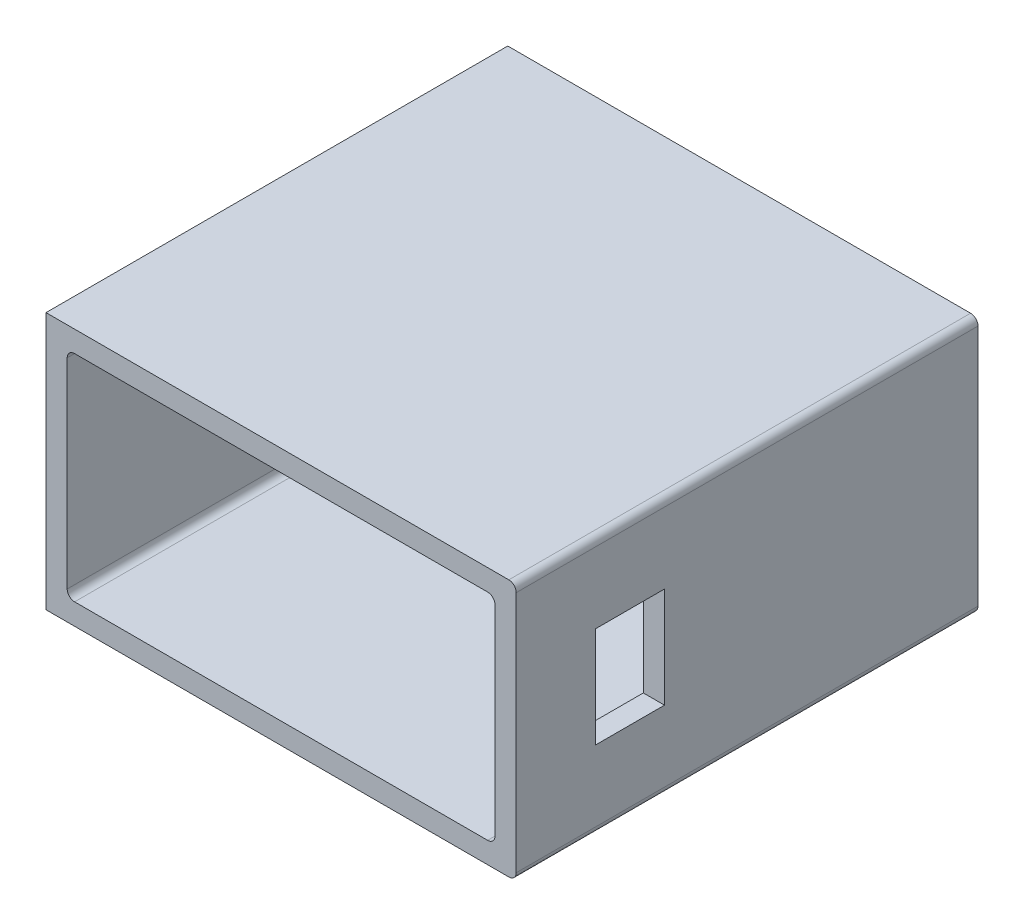
ISO-10303-21;
HEADER;
FILE_DESCRIPTION(('STEP AP214'),'2;1');
FILE_NAME('part.step','',(''),(''),'','','');
FILE_SCHEMA(('AUTOMOTIVE_DESIGN { 1 0 10303 214 1 1 1 1 }'));
ENDSEC;
DATA;
#1=APPLICATION_CONTEXT('core data for automotive mechanical design processes');
#2=APPLICATION_PROTOCOL_DEFINITION('international standard','automotive_design',2000,#1);
#3=PRODUCT_CONTEXT('',#1,'mechanical');
#4=PRODUCT('Part','Part','',(#3));
#5=PRODUCT_RELATED_PRODUCT_CATEGORY('part','',(#4));
#6=PRODUCT_DEFINITION_FORMATION('','',#4);
#7=PRODUCT_DEFINITION_CONTEXT('part definition',#1,'design');
#8=PRODUCT_DEFINITION('design','',#6,#7);
#9=PRODUCT_DEFINITION_SHAPE('','',#8);
#10=(LENGTH_UNIT() NAMED_UNIT(*) SI_UNIT(.MILLI.,.METRE.));
#11=(NAMED_UNIT(*) PLANE_ANGLE_UNIT() SI_UNIT($,.RADIAN.));
#12=(NAMED_UNIT(*) SI_UNIT($,.STERADIAN.) SOLID_ANGLE_UNIT());
#13=UNCERTAINTY_MEASURE_WITH_UNIT(LENGTH_MEASURE(1.E-05),#10,'distance_accuracy_value','');
#14=(GEOMETRIC_REPRESENTATION_CONTEXT(3) GLOBAL_UNCERTAINTY_ASSIGNED_CONTEXT((#13)) GLOBAL_UNIT_ASSIGNED_CONTEXT((#10,
#11,#12)) REPRESENTATION_CONTEXT('',''));
#15=CARTESIAN_POINT('',(0.,0.,0.));
#16=DIRECTION('',(0.,0.,1.));
#17=DIRECTION('',(1.,0.,0.));
#18=AXIS2_PLACEMENT_3D('',#15,#16,#17);
#19=CARTESIAN_POINT('',(0.,12.15,42.));
#20=DIRECTION('',(0.,1.,0.));
#21=DIRECTION('',(0.,0.,1.));
#22=AXIS2_PLACEMENT_3D('',#19,#20,#21);
#23=PLANE('',#22);
#24=DIRECTION('',(1.,0.,0.));
#25=VECTOR('',#24,1.);
#26=CARTESIAN_POINT('',(0.,12.15,42.));
#27=LINE('',#26,#25);
#28=CARTESIAN_POINT('',(58.2500000000001,12.1499999999999,42.));
#29=VERTEX_POINT('',#28);
#30=CARTESIAN_POINT('',(101.95,12.15,42.));
#31=VERTEX_POINT('',#30);
#32=EDGE_CURVE('E274',#29,#31,#27,.T.);
#33=ORIENTED_EDGE('',*,*,#32,.T.);
#34=DIRECTION('',(0.,0.,-1.));
#35=VECTOR('',#34,1.);
#36=CARTESIAN_POINT('',(101.95,12.15,42.));
#37=LINE('',#36,#35);
#38=CARTESIAN_POINT('',(101.95,12.1499999999999,-1.6));
#39=VERTEX_POINT('',#38);
#40=EDGE_CURVE('E206',#31,#39,#37,.T.);
#41=ORIENTED_EDGE('',*,*,#40,.T.);
#42=DIRECTION('',(1.,0.,0.));
#43=VECTOR('',#42,1.);
#44=CARTESIAN_POINT('',(102.65,12.1499999999999,-1.6));
#45=LINE('',#44,#43);
#46=CARTESIAN_POINT('',(58.2500000000001,12.1499999999999,-1.6));
#47=VERTEX_POINT('',#46);
#48=EDGE_CURVE('E203',#47,#39,#45,.T.);
#49=ORIENTED_EDGE('',*,*,#48,.F.);
#50=DIRECTION('',(0.,0.,-1.));
#51=VECTOR('',#50,1.);
#52=CARTESIAN_POINT('',(58.25,12.15,42.));
#53=LINE('',#52,#51);
#54=EDGE_CURVE('E56',#29,#47,#53,.T.);
#55=ORIENTED_EDGE('',*,*,#54,.F.);
#56=EDGE_LOOP('',(#33,#41,#49,#55));
#57=FACE_BOUND('',#56,.T.);
#58=ADVANCED_FACE('F39',(#57),#23,.T.);
#59=CARTESIAN_POINT('',(0.,-12.15,42.));
#60=DIRECTION('',(0.,1.,0.));
#61=DIRECTION('',(-1.,0.,0.));
#62=AXIS2_PLACEMENT_3D('',#59,#60,#61);
#63=PLANE('',#62);
#64=DIRECTION('',(0.,0.,-1.));
#65=VECTOR('',#64,1.);
#66=CARTESIAN_POINT('',(101.95,-12.15,42.));
#67=LINE('',#66,#65);
#68=CARTESIAN_POINT('',(101.95,-12.1500000000002,-1.6));
#69=VERTEX_POINT('',#68);
#70=CARTESIAN_POINT('',(101.95,-12.15,42.));
#71=VERTEX_POINT('',#70);
#72=EDGE_CURVE('E177',#69,#71,#67,.F.);
#73=ORIENTED_EDGE('',*,*,#72,.T.);
#74=DIRECTION('',(1.,0.,0.));
#75=VECTOR('',#74,1.);
#76=CARTESIAN_POINT('',(-1.54606372121942E-13,-12.1499999999993,42.));
#77=LINE('',#76,#75);
#78=CARTESIAN_POINT('',(58.25,-12.15,42.));
#79=VERTEX_POINT('',#78);
#80=EDGE_CURVE('E43',#79,#71,#77,.T.);
#81=ORIENTED_EDGE('',*,*,#80,.F.);
#82=DIRECTION('',(0.,0.,-1.));
#83=VECTOR('',#82,1.);
#84=CARTESIAN_POINT('',(58.25,-12.15,42.));
#85=LINE('',#84,#83);
#86=CARTESIAN_POINT('',(58.2500000000001,-12.1500000000001,-1.6));
#87=VERTEX_POINT('',#86);
#88=EDGE_CURVE('E64',#79,#87,#85,.T.);
#89=ORIENTED_EDGE('',*,*,#88,.T.);
#90=DIRECTION('',(-1.,0.,0.));
#91=VECTOR('',#90,1.);
#92=CARTESIAN_POINT('',(58.2500000000001,-12.1500000000001,-1.6));
#93=LINE('',#92,#91);
#94=EDGE_CURVE('E180',#69,#87,#93,.T.);
#95=ORIENTED_EDGE('',*,*,#94,.F.);
#96=EDGE_LOOP('',(#73,#81,#89,#95));
#97=FACE_BOUND('',#96,.T.);
#98=ADVANCED_FACE('F178',(#97),#63,.F.);
#99=CARTESIAN_POINT('',(0.,0.,42.));
#100=DIRECTION('',(0.,0.,-1.));
#101=DIRECTION('',(-1.,0.,0.));
#102=AXIS2_PLACEMENT_3D('',#99,#100,#101);
#103=PLANE('',#102);
#104=DIRECTION('',(0.,-1.,0.));
#105=VECTOR('',#104,1.);
#106=CARTESIAN_POINT('',(58.2500000000001,-1.66333567861151E-13,42.));
#107=LINE('',#106,#105);
#108=EDGE_CURVE('E173',#29,#79,#107,.T.);
#109=ORIENTED_EDGE('',*,*,#108,.T.);
#110=ORIENTED_EDGE('',*,*,#80,.T.);
#111=CARTESIAN_POINT('',(101.95,-11.45,42.));
#112=DIRECTION('',(0.,0.,1.));
#113=DIRECTION('',(1.,0.,0.));
#114=AXIS2_PLACEMENT_3D('',#111,#112,#113);
#115=CIRCLE('',#114,0.7);
#116=CARTESIAN_POINT('',(102.65,-11.45,42.));
#117=VERTEX_POINT('',#116);
#118=EDGE_CURVE('E171',#71,#117,#115,.T.);
#119=ORIENTED_EDGE('',*,*,#118,.T.);
#120=DIRECTION('',(0.,-1.,0.));
#121=VECTOR('',#120,1.);
#122=CARTESIAN_POINT('',(102.65,0.,42.));
#123=LINE('',#122,#121);
#124=CARTESIAN_POINT('',(102.65,11.45,42.));
#125=VERTEX_POINT('',#124);
#126=EDGE_CURVE('E196',#125,#117,#123,.T.);
#127=ORIENTED_EDGE('',*,*,#126,.F.);
#128=CARTESIAN_POINT('',(101.95,11.45,42.));
#129=DIRECTION('',(0.,0.,1.));
#130=DIRECTION('',(1.,0.,0.));
#131=AXIS2_PLACEMENT_3D('',#128,#129,#130);
#132=CIRCLE('',#131,0.7);
#133=EDGE_CURVE('E188',#125,#31,#132,.T.);
#134=ORIENTED_EDGE('',*,*,#133,.T.);
#135=ORIENTED_EDGE('',*,*,#32,.F.);
#136=EDGE_LOOP('',(#109,#110,#119,#127,#134,#135));
#137=FACE_BOUND('',#136,.T.);
#138=DIRECTION('',(0.,-1.,0.));
#139=VECTOR('',#138,1.);
#140=CARTESIAN_POINT('',(60.25,0.,42.));
#141=LINE('',#140,#139);
#142=CARTESIAN_POINT('',(60.25,9.45,42.));
#143=VERTEX_POINT('',#142);
#144=CARTESIAN_POINT('',(60.25,-9.45,42.));
#145=VERTEX_POINT('',#144);
#146=EDGE_CURVE('E242',#143,#145,#141,.T.);
#147=ORIENTED_EDGE('',*,*,#146,.F.);
#148=CARTESIAN_POINT('',(60.95,9.45,42.));
#149=DIRECTION('',(0.,0.,1.));
#150=DIRECTION('',(1.,0.,0.));
#151=AXIS2_PLACEMENT_3D('',#148,#149,#150);
#152=CIRCLE('',#151,0.7);
#153=CARTESIAN_POINT('',(60.95,10.15,42.));
#154=VERTEX_POINT('',#153);
#155=EDGE_CURVE('E191',#143,#154,#152,.F.);
#156=ORIENTED_EDGE('',*,*,#155,.T.);
#157=DIRECTION('',(1.,0.,0.));
#158=VECTOR('',#157,1.);
#159=CARTESIAN_POINT('',(0.,10.15,42.));
#160=LINE('',#159,#158);
#161=CARTESIAN_POINT('',(99.95,10.15,42.));
#162=VERTEX_POINT('',#161);
#163=EDGE_CURVE('E223',#154,#162,#160,.T.);
#164=ORIENTED_EDGE('',*,*,#163,.T.);
#165=CARTESIAN_POINT('',(99.95,9.45,42.));
#166=DIRECTION('',(0.,0.,1.));
#167=DIRECTION('',(1.,0.,0.));
#168=AXIS2_PLACEMENT_3D('',#165,#166,#167);
#169=CIRCLE('',#168,0.7);
#170=CARTESIAN_POINT('',(100.65,9.45,42.));
#171=VERTEX_POINT('',#170);
#172=EDGE_CURVE('E220',#162,#171,#169,.F.);
#173=ORIENTED_EDGE('',*,*,#172,.T.);
#174=DIRECTION('',(0.,-1.,0.));
#175=VECTOR('',#174,1.);
#176=CARTESIAN_POINT('',(100.65,0.,42.));
#177=LINE('',#176,#175);
#178=CARTESIAN_POINT('',(100.65,-9.45,42.));
#179=VERTEX_POINT('',#178);
#180=EDGE_CURVE('E222',#171,#179,#177,.T.);
#181=ORIENTED_EDGE('',*,*,#180,.T.);
#182=CARTESIAN_POINT('',(99.95,-9.45,42.));
#183=DIRECTION('',(0.,0.,1.));
#184=DIRECTION('',(1.,0.,0.));
#185=AXIS2_PLACEMENT_3D('',#182,#183,#184);
#186=CIRCLE('',#185,0.7);
#187=CARTESIAN_POINT('',(99.95,-10.15,42.));
#188=VERTEX_POINT('',#187);
#189=EDGE_CURVE('E224',#179,#188,#186,.F.);
#190=ORIENTED_EDGE('',*,*,#189,.T.);
#191=DIRECTION('',(1.,0.,0.));
#192=VECTOR('',#191,1.);
#193=CARTESIAN_POINT('',(0.,-10.15,42.));
#194=LINE('',#193,#192);
#195=CARTESIAN_POINT('',(60.95,-10.15,42.));
#196=VERTEX_POINT('',#195);
#197=EDGE_CURVE('E236',#196,#188,#194,.T.);
#198=ORIENTED_EDGE('',*,*,#197,.F.);
#199=CARTESIAN_POINT('',(60.95,-9.45,42.));
#200=DIRECTION('',(0.,0.,1.));
#201=DIRECTION('',(1.,0.,0.));
#202=AXIS2_PLACEMENT_3D('',#199,#200,#201);
#203=CIRCLE('',#202,0.7);
#204=EDGE_CURVE('E209',#196,#145,#203,.F.);
#205=ORIENTED_EDGE('',*,*,#204,.T.);
#206=EDGE_LOOP('',(#147,#156,#164,#173,#181,#190,#198,#205));
#207=FACE_BOUND('',#206,.T.);
#208=ADVANCED_FACE('F167',(#137,#207),#103,.F.);
#209=CARTESIAN_POINT('',(58.25,0.,42.));
#210=DIRECTION('',(1.,0.,0.));
#211=DIRECTION('',(0.,0.,-1.));
#212=AXIS2_PLACEMENT_3D('',#209,#210,#211);
#213=PLANE('',#212);
#214=ORIENTED_EDGE('',*,*,#88,.F.);
#215=ORIENTED_EDGE('',*,*,#108,.F.);
#216=ORIENTED_EDGE('',*,*,#54,.T.);
#217=DIRECTION('',(0.,1.,0.));
#218=VECTOR('',#217,1.);
#219=CARTESIAN_POINT('',(58.2500000000001,12.1499999999999,-1.6));
#220=LINE('',#219,#218);
#221=EDGE_CURVE('E286',#87,#47,#220,.T.);
#222=ORIENTED_EDGE('',*,*,#221,.F.);
#223=EDGE_LOOP('',(#214,#215,#216,#222));
#224=FACE_BOUND('',#223,.T.);
#225=ADVANCED_FACE('F392',(#224),#213,.F.);
#226=CARTESIAN_POINT('',(0.,10.15,42.));
#227=DIRECTION('',(0.,1.,0.));
#228=DIRECTION('',(0.,0.,1.));
#229=AXIS2_PLACEMENT_3D('',#226,#227,#228);
#230=PLANE('',#229);
#231=ORIENTED_EDGE('',*,*,#163,.F.);
#232=DIRECTION('',(0.,0.,-1.));
#233=VECTOR('',#232,1.);
#234=CARTESIAN_POINT('',(60.95,10.15,42.));
#235=LINE('',#234,#233);
#236=CARTESIAN_POINT('',(60.95,10.15,0.));
#237=VERTEX_POINT('',#236);
#238=EDGE_CURVE('E182',#154,#237,#235,.T.);
#239=ORIENTED_EDGE('',*,*,#238,.T.);
#240=DIRECTION('',(1.,0.,0.));
#241=VECTOR('',#240,1.);
#242=CARTESIAN_POINT('',(0.,10.15,0.));
#243=LINE('',#242,#241);
#244=CARTESIAN_POINT('',(99.95,10.15,0.));
#245=VERTEX_POINT('',#244);
#246=EDGE_CURVE('E258',#237,#245,#243,.T.);
#247=ORIENTED_EDGE('',*,*,#246,.T.);
#248=DIRECTION('',(0.,0.,-1.));
#249=VECTOR('',#248,1.);
#250=CARTESIAN_POINT('',(99.95,10.15,42.));
#251=LINE('',#250,#249);
#252=EDGE_CURVE('E259',#245,#162,#251,.F.);
#253=ORIENTED_EDGE('',*,*,#252,.T.);
#254=EDGE_LOOP('',(#231,#239,#247,#253));
#255=FACE_BOUND('',#254,.T.);
#256=ADVANCED_FACE('F394',(#255),#230,.F.);
#257=CARTESIAN_POINT('',(100.65,0.,42.));
#258=DIRECTION('',(1.,0.,0.));
#259=DIRECTION('',(0.,1.,0.));
#260=AXIS2_PLACEMENT_3D('',#257,#258,#259);
#261=PLANE('',#260);
#262=DIRECTION('',(0.,0.,1.));
#263=VECTOR('',#262,1.);
#264=CARTESIAN_POINT('',(100.65,4.75,42.));
#265=LINE('',#264,#263);
#266=CARTESIAN_POINT('',(100.65,4.75,28.));
#267=VERTEX_POINT('',#266);
#268=CARTESIAN_POINT('',(100.65,4.75,34.5));
#269=VERTEX_POINT('',#268);
#270=EDGE_CURVE('E261',#267,#269,#265,.T.);
#271=ORIENTED_EDGE('',*,*,#270,.T.);
#272=DIRECTION('',(0.,-1.,0.));
#273=VECTOR('',#272,1.);
#274=CARTESIAN_POINT('',(100.65,0.,34.5));
#275=LINE('',#274,#273);
#276=CARTESIAN_POINT('',(100.65,-4.75,34.5));
#277=VERTEX_POINT('',#276);
#278=EDGE_CURVE('E329',#269,#277,#275,.T.);
#279=ORIENTED_EDGE('',*,*,#278,.T.);
#280=DIRECTION('',(0.,0.,-1.));
#281=VECTOR('',#280,1.);
#282=CARTESIAN_POINT('',(100.65,-4.75,42.));
#283=LINE('',#282,#281);
#284=CARTESIAN_POINT('',(100.65,-4.75,28.));
#285=VERTEX_POINT('',#284);
#286=EDGE_CURVE('E332',#277,#285,#283,.T.);
#287=ORIENTED_EDGE('',*,*,#286,.T.);
#288=DIRECTION('',(0.,1.,0.));
#289=VECTOR('',#288,1.);
#290=CARTESIAN_POINT('',(100.65,0.,28.));
#291=LINE('',#290,#289);
#292=EDGE_CURVE('E270',#285,#267,#291,.T.);
#293=ORIENTED_EDGE('',*,*,#292,.T.);
#294=EDGE_LOOP('',(#271,#279,#287,#293));
#295=FACE_BOUND('',#294,.T.);
#296=DIRECTION('',(0.,-1.,0.));
#297=VECTOR('',#296,1.);
#298=CARTESIAN_POINT('',(100.65,0.,0.));
#299=LINE('',#298,#297);
#300=CARTESIAN_POINT('',(100.65,9.45,0.));
#301=VERTEX_POINT('',#300);
#302=CARTESIAN_POINT('',(100.65,-9.45,0.));
#303=VERTEX_POINT('',#302);
#304=EDGE_CURVE('E231',#301,#303,#299,.T.);
#305=ORIENTED_EDGE('',*,*,#304,.T.);
#306=DIRECTION('',(0.,0.,-1.));
#307=VECTOR('',#306,1.);
#308=CARTESIAN_POINT('',(100.65,-9.45,42.));
#309=LINE('',#308,#307);
#310=EDGE_CURVE('E228',#303,#179,#309,.F.);
#311=ORIENTED_EDGE('',*,*,#310,.T.);
#312=ORIENTED_EDGE('',*,*,#180,.F.);
#313=DIRECTION('',(0.,0.,-1.));
#314=VECTOR('',#313,1.);
#315=CARTESIAN_POINT('',(100.65,9.45,0.));
#316=LINE('',#315,#314);
#317=EDGE_CURVE('E230',#171,#301,#316,.T.);
#318=ORIENTED_EDGE('',*,*,#317,.T.);
#319=EDGE_LOOP('',(#305,#311,#312,#318));
#320=FACE_BOUND('',#319,.T.);
#321=ADVANCED_FACE('F371',(#295,#320),#261,.F.);
#322=CARTESIAN_POINT('',(0.,-10.15,42.));
#323=DIRECTION('',(0.,1.,0.));
#324=DIRECTION('',(0.,0.,1.));
#325=AXIS2_PLACEMENT_3D('',#322,#323,#324);
#326=PLANE('',#325);
#327=DIRECTION('',(1.,0.,0.));
#328=VECTOR('',#327,1.);
#329=CARTESIAN_POINT('',(0.,-10.15,0.));
#330=LINE('',#329,#328);
#331=CARTESIAN_POINT('',(60.95,-10.15,0.));
#332=VERTEX_POINT('',#331);
#333=CARTESIAN_POINT('',(99.95,-10.15,0.));
#334=VERTEX_POINT('',#333);
#335=EDGE_CURVE('E251',#332,#334,#330,.T.);
#336=ORIENTED_EDGE('',*,*,#335,.F.);
#337=DIRECTION('',(0.,0.,-1.));
#338=VECTOR('',#337,1.);
#339=CARTESIAN_POINT('',(60.95,-10.15,42.));
#340=LINE('',#339,#338);
#341=EDGE_CURVE('E234',#332,#196,#340,.F.);
#342=ORIENTED_EDGE('',*,*,#341,.T.);
#343=ORIENTED_EDGE('',*,*,#197,.T.);
#344=DIRECTION('',(0.,0.,-1.));
#345=VECTOR('',#344,1.);
#346=CARTESIAN_POINT('',(99.95,-10.15,42.));
#347=LINE('',#346,#345);
#348=EDGE_CURVE('E237',#188,#334,#347,.T.);
#349=ORIENTED_EDGE('',*,*,#348,.T.);
#350=EDGE_LOOP('',(#336,#342,#343,#349));
#351=FACE_BOUND('',#350,.T.);
#352=ADVANCED_FACE('F479',(#351),#326,.T.);
#353=CARTESIAN_POINT('',(60.25,0.,42.));
#354=DIRECTION('',(1.,0.,0.));
#355=DIRECTION('',(0.,0.,-1.));
#356=AXIS2_PLACEMENT_3D('',#353,#354,#355);
#357=PLANE('',#356);
#358=DIRECTION('',(0.,-1.,0.));
#359=VECTOR('',#358,1.);
#360=CARTESIAN_POINT('',(60.25,0.,0.));
#361=LINE('',#360,#359);
#362=CARTESIAN_POINT('',(60.25,9.45,0.));
#363=VERTEX_POINT('',#362);
#364=CARTESIAN_POINT('',(60.25,-9.45,0.));
#365=VERTEX_POINT('',#364);
#366=EDGE_CURVE('E247',#363,#365,#361,.T.);
#367=ORIENTED_EDGE('',*,*,#366,.F.);
#368=DIRECTION('',(0.,0.,-1.));
#369=VECTOR('',#368,1.);
#370=CARTESIAN_POINT('',(60.25,9.45,42.));
#371=LINE('',#370,#369);
#372=EDGE_CURVE('E240',#363,#143,#371,.F.);
#373=ORIENTED_EDGE('',*,*,#372,.T.);
#374=ORIENTED_EDGE('',*,*,#146,.T.);
#375=DIRECTION('',(0.,0.,-1.));
#376=VECTOR('',#375,1.);
#377=CARTESIAN_POINT('',(60.25,-9.45,0.));
#378=LINE('',#377,#376);
#379=EDGE_CURVE('E197',#145,#365,#378,.T.);
#380=ORIENTED_EDGE('',*,*,#379,.T.);
#381=EDGE_LOOP('',(#367,#373,#374,#380));
#382=FACE_BOUND('',#381,.T.);
#383=ADVANCED_FACE('F390',(#382),#357,.T.);
#384=CARTESIAN_POINT('',(102.65,0.,42.));
#385=DIRECTION('',(1.,0.,0.));
#386=DIRECTION('',(0.,0.,-1.));
#387=AXIS2_PLACEMENT_3D('',#384,#385,#386);
#388=PLANE('',#387);
#389=DIRECTION('',(0.,-1.,0.));
#390=VECTOR('',#389,1.);
#391=CARTESIAN_POINT('',(102.65,4.75,34.5));
#392=LINE('',#391,#390);
#393=CARTESIAN_POINT('',(102.65,4.75,34.5));
#394=VERTEX_POINT('',#393);
#395=CARTESIAN_POINT('',(102.65,-4.75,34.5));
#396=VERTEX_POINT('',#395);
#397=EDGE_CURVE('E347',#394,#396,#392,.T.);
#398=ORIENTED_EDGE('',*,*,#397,.F.);
#399=DIRECTION('',(0.,0.,1.));
#400=VECTOR('',#399,1.);
#401=CARTESIAN_POINT('',(102.65,4.75,34.5));
#402=LINE('',#401,#400);
#403=CARTESIAN_POINT('',(102.65,4.75,28.));
#404=VERTEX_POINT('',#403);
#405=EDGE_CURVE('E344',#404,#394,#402,.T.);
#406=ORIENTED_EDGE('',*,*,#405,.F.);
#407=DIRECTION('',(0.,1.,0.));
#408=VECTOR('',#407,1.);
#409=CARTESIAN_POINT('',(102.65,4.75,28.));
#410=LINE('',#409,#408);
#411=CARTESIAN_POINT('',(102.65,-4.75,28.));
#412=VERTEX_POINT('',#411);
#413=EDGE_CURVE('E341',#412,#404,#410,.T.);
#414=ORIENTED_EDGE('',*,*,#413,.F.);
#415=DIRECTION('',(0.,0.,-1.));
#416=VECTOR('',#415,1.);
#417=CARTESIAN_POINT('',(102.65,-4.75,34.5));
#418=LINE('',#417,#416);
#419=EDGE_CURVE('E11',#396,#412,#418,.T.);
#420=ORIENTED_EDGE('',*,*,#419,.F.);
#421=EDGE_LOOP('',(#398,#406,#414,#420));
#422=FACE_BOUND('',#421,.T.);
#423=DIRECTION('',(0.,-1.,0.));
#424=VECTOR('',#423,1.);
#425=CARTESIAN_POINT('',(102.65,-12.1500000000002,-1.6));
#426=LINE('',#425,#424);
#427=CARTESIAN_POINT('',(102.65,11.45,-1.6));
#428=VERTEX_POINT('',#427);
#429=CARTESIAN_POINT('',(102.65,-11.45,-1.6));
#430=VERTEX_POINT('',#429);
#431=EDGE_CURVE('E202',#428,#430,#426,.T.);
#432=ORIENTED_EDGE('',*,*,#431,.F.);
#433=DIRECTION('',(0.,0.,-1.));
#434=VECTOR('',#433,1.);
#435=CARTESIAN_POINT('',(102.65,11.45,42.));
#436=LINE('',#435,#434);
#437=EDGE_CURVE('E194',#428,#125,#436,.F.);
#438=ORIENTED_EDGE('',*,*,#437,.T.);
#439=ORIENTED_EDGE('',*,*,#126,.T.);
#440=DIRECTION('',(0.,0.,-1.));
#441=VECTOR('',#440,1.);
#442=CARTESIAN_POINT('',(102.65,-11.45,-1.6));
#443=LINE('',#442,#441);
#444=EDGE_CURVE('E187',#117,#430,#443,.T.);
#445=ORIENTED_EDGE('',*,*,#444,.T.);
#446=EDGE_LOOP('',(#432,#438,#439,#445));
#447=FACE_BOUND('',#446,.T.);
#448=ADVANCED_FACE('F364',(#422,#447),#388,.T.);
#449=CARTESIAN_POINT('',(0.,0.,0.));
#450=DIRECTION('',(0.,0.,1.));
#451=DIRECTION('',(1.,0.,0.));
#452=AXIS2_PLACEMENT_3D('',#449,#450,#451);
#453=PLANE('',#452);
#454=CARTESIAN_POINT('',(83.7,7.99999999999992,0.));
#455=DIRECTION('',(0.,0.,-1.));
#456=DIRECTION('',(1.,0.,0.));
#457=AXIS2_PLACEMENT_3D('',#454,#455,#456);
#458=CIRCLE('',#457,0.80000000000002);
#459=CARTESIAN_POINT('',(84.5000000000001,7.99999999999992,0.));
#460=VERTEX_POINT('',#459);
#461=EDGE_CURVE('E199',#460,#460,#458,.T.);
#462=ORIENTED_EDGE('',*,*,#461,.T.);
#463=EDGE_LOOP('',(#462));
#464=FACE_BOUND('',#463,.T.);
#465=CARTESIAN_POINT('',(63.4800000000001,-1.11022302462516E-13,0.));
#466=DIRECTION('',(0.,0.,-1.));
#467=DIRECTION('',(-1.,0.,0.));
#468=AXIS2_PLACEMENT_3D('',#465,#466,#467);
#469=CIRCLE('',#468,0.800000000000014);
#470=CARTESIAN_POINT('',(62.6800000000001,-1.11022302462516E-13,0.));
#471=VERTEX_POINT('',#470);
#472=EDGE_CURVE('E303',#471,#471,#469,.T.);
#473=ORIENTED_EDGE('',*,*,#472,.T.);
#474=EDGE_LOOP('',(#473));
#475=FACE_BOUND('',#474,.T.);
#476=CARTESIAN_POINT('',(83.7000000000001,-8.00000000000012,0.));
#477=DIRECTION('',(0.,0.,-1.));
#478=DIRECTION('',(-1.,0.,0.));
#479=AXIS2_PLACEMENT_3D('',#476,#477,#478);
#480=CIRCLE('',#479,0.800000000000023);
#481=CARTESIAN_POINT('',(82.9000000000001,-8.00000000000012,0.));
#482=VERTEX_POINT('',#481);
#483=EDGE_CURVE('E297',#482,#482,#480,.T.);
#484=ORIENTED_EDGE('',*,*,#483,.T.);
#485=EDGE_LOOP('',(#484));
#486=FACE_BOUND('',#485,.T.);
#487=CARTESIAN_POINT('',(90.5000000000001,0.,0.));
#488=DIRECTION('',(0.,0.,-1.));
#489=DIRECTION('',(-1.,0.,0.));
#490=AXIS2_PLACEMENT_3D('',#487,#488,#489);
#491=CIRCLE('',#490,6.7500000000001);
#492=CARTESIAN_POINT('',(83.75,0.,0.));
#493=VERTEX_POINT('',#492);
#494=EDGE_CURVE('E293',#493,#493,#491,.T.);
#495=ORIENTED_EDGE('',*,*,#494,.T.);
#496=EDGE_LOOP('',(#495));
#497=FACE_BOUND('',#496,.T.);
#498=CARTESIAN_POINT('',(70.4800000000001,-7.00000000000014,0.));
#499=DIRECTION('',(0.,0.,-1.));
#500=DIRECTION('',(-1.,0.,0.));
#501=AXIS2_PLACEMENT_3D('',#498,#499,#500);
#502=CIRCLE('',#501,0.80000000000003);
#503=CARTESIAN_POINT('',(69.6800000000001,-7.00000000000014,0.));
#504=VERTEX_POINT('',#503);
#505=EDGE_CURVE('E296',#504,#504,#502,.T.);
#506=ORIENTED_EDGE('',*,*,#505,.T.);
#507=EDGE_LOOP('',(#506));
#508=FACE_BOUND('',#507,.T.);
#509=CARTESIAN_POINT('',(70.4800000000001,6.99999999999992,0.));
#510=DIRECTION('',(0.,0.,-1.));
#511=DIRECTION('',(1.,0.,0.));
#512=AXIS2_PLACEMENT_3D('',#509,#510,#511);
#513=CIRCLE('',#512,0.799999999999997);
#514=CARTESIAN_POINT('',(71.2800000000001,6.99999999999992,0.));
#515=VERTEX_POINT('',#514);
#516=EDGE_CURVE('E248',#515,#515,#513,.T.);
#517=ORIENTED_EDGE('',*,*,#516,.T.);
#518=EDGE_LOOP('',(#517));
#519=FACE_BOUND('',#518,.T.);
#520=ORIENTED_EDGE('',*,*,#246,.F.);
#521=CARTESIAN_POINT('',(60.95,9.45,0.));
#522=DIRECTION('',(0.,0.,1.));
#523=DIRECTION('',(1.,0.,0.));
#524=AXIS2_PLACEMENT_3D('',#521,#522,#523);
#525=CIRCLE('',#524,0.7);
#526=EDGE_CURVE('E245',#237,#363,#525,.T.);
#527=ORIENTED_EDGE('',*,*,#526,.T.);
#528=ORIENTED_EDGE('',*,*,#366,.T.);
#529=CARTESIAN_POINT('',(60.95,-9.45,0.));
#530=DIRECTION('',(0.,0.,1.));
#531=DIRECTION('',(1.,0.,0.));
#532=AXIS2_PLACEMENT_3D('',#529,#530,#531);
#533=CIRCLE('',#532,0.7);
#534=EDGE_CURVE('E249',#365,#332,#533,.T.);
#535=ORIENTED_EDGE('',*,*,#534,.T.);
#536=ORIENTED_EDGE('',*,*,#335,.T.);
#537=CARTESIAN_POINT('',(99.95,-9.45,0.));
#538=DIRECTION('',(0.,0.,1.));
#539=DIRECTION('',(1.,0.,0.));
#540=AXIS2_PLACEMENT_3D('',#537,#538,#539);
#541=CIRCLE('',#540,0.7);
#542=EDGE_CURVE('E252',#334,#303,#541,.T.);
#543=ORIENTED_EDGE('',*,*,#542,.T.);
#544=ORIENTED_EDGE('',*,*,#304,.F.);
#545=CARTESIAN_POINT('',(99.95,9.45,0.));
#546=DIRECTION('',(0.,0.,1.));
#547=DIRECTION('',(1.,0.,0.));
#548=AXIS2_PLACEMENT_3D('',#545,#546,#547);
#549=CIRCLE('',#548,0.7);
#550=EDGE_CURVE('E254',#301,#245,#549,.T.);
#551=ORIENTED_EDGE('',*,*,#550,.T.);
#552=EDGE_LOOP('',(#520,#527,#528,#535,#536,#543,#544,#551));
#553=FACE_BOUND('',#552,.T.);
#554=ADVANCED_FACE('F398',(#464,#475,#486,#497,#508,#519,#553),#453,.T.);
#555=CARTESIAN_POINT('',(0.,0.,-1.6));
#556=DIRECTION('',(0.,0.,1.));
#557=DIRECTION('',(1.,0.,0.));
#558=AXIS2_PLACEMENT_3D('',#555,#556,#557);
#559=PLANE('',#558);
#560=CARTESIAN_POINT('',(83.7000000000001,-7.99999999999999,-1.6));
#561=DIRECTION('',(0.,0.,-1.));
#562=DIRECTION('',(1.,0.,0.));
#563=AXIS2_PLACEMENT_3D('',#560,#561,#562);
#564=CIRCLE('',#563,2.);
#565=CARTESIAN_POINT('',(85.7000000000001,-7.99999999999999,-1.6));
#566=VERTEX_POINT('',#565);
#567=EDGE_CURVE('E214',#566,#566,#564,.T.);
#568=ORIENTED_EDGE('',*,*,#567,.F.);
#569=EDGE_LOOP('',(#568));
#570=FACE_BOUND('',#569,.T.);
#571=CARTESIAN_POINT('',(83.7,8.00000000000002,-1.6));
#572=DIRECTION('',(0.,0.,-1.));
#573=DIRECTION('',(1.,0.,0.));
#574=AXIS2_PLACEMENT_3D('',#571,#572,#573);
#575=CIRCLE('',#574,2.);
#576=CARTESIAN_POINT('',(85.7000000000001,8.00000000000002,-1.6));
#577=VERTEX_POINT('',#576);
#578=EDGE_CURVE('E219',#577,#577,#575,.T.);
#579=ORIENTED_EDGE('',*,*,#578,.F.);
#580=EDGE_LOOP('',(#579));
#581=FACE_BOUND('',#580,.T.);
#582=ORIENTED_EDGE('',*,*,#48,.T.);
#583=CARTESIAN_POINT('',(101.95,11.45,-1.6));
#584=DIRECTION('',(0.,0.,1.));
#585=DIRECTION('',(1.,0.,0.));
#586=AXIS2_PLACEMENT_3D('',#583,#584,#585);
#587=CIRCLE('',#586,0.7);
#588=EDGE_CURVE('E200',#39,#428,#587,.F.);
#589=ORIENTED_EDGE('',*,*,#588,.T.);
#590=ORIENTED_EDGE('',*,*,#431,.T.);
#591=CARTESIAN_POINT('',(101.95,-11.45,-1.6));
#592=DIRECTION('',(0.,0.,1.));
#593=DIRECTION('',(1.,0.,0.));
#594=AXIS2_PLACEMENT_3D('',#591,#592,#593);
#595=CIRCLE('',#594,0.7);
#596=EDGE_CURVE('E204',#430,#69,#595,.F.);
#597=ORIENTED_EDGE('',*,*,#596,.T.);
#598=ORIENTED_EDGE('',*,*,#94,.T.);
#599=ORIENTED_EDGE('',*,*,#221,.T.);
#600=EDGE_LOOP('',(#582,#589,#590,#597,#598,#599));
#601=FACE_BOUND('',#600,.T.);
#602=CARTESIAN_POINT('',(90.5000000000001,0.,-1.6));
#603=DIRECTION('',(0.,0.,-1.));
#604=DIRECTION('',(-1.,0.,0.));
#605=AXIS2_PLACEMENT_3D('',#602,#603,#604);
#606=CIRCLE('',#605,6.7500000000001);
#607=CARTESIAN_POINT('',(83.75,0.,-1.6));
#608=VERTEX_POINT('',#607);
#609=EDGE_CURVE('E289',#608,#608,#606,.T.);
#610=ORIENTED_EDGE('',*,*,#609,.F.);
#611=EDGE_LOOP('',(#610));
#612=FACE_BOUND('',#611,.T.);
#613=CARTESIAN_POINT('',(70.4800000000001,-7.00000000000014,-1.6));
#614=DIRECTION('',(0.,0.,-1.));
#615=DIRECTION('',(-1.,0.,0.));
#616=AXIS2_PLACEMENT_3D('',#613,#614,#615);
#617=CIRCLE('',#616,0.80000000000003);
#618=CARTESIAN_POINT('',(69.6800000000001,-7.00000000000014,-1.6));
#619=VERTEX_POINT('',#618);
#620=EDGE_CURVE('E300',#619,#619,#617,.T.);
#621=ORIENTED_EDGE('',*,*,#620,.F.);
#622=EDGE_LOOP('',(#621));
#623=FACE_BOUND('',#622,.T.);
#624=CARTESIAN_POINT('',(63.4800000000001,-1.11022302462516E-13,-1.6));
#625=DIRECTION('',(0.,0.,-1.));
#626=DIRECTION('',(-1.,0.,0.));
#627=AXIS2_PLACEMENT_3D('',#624,#625,#626);
#628=CIRCLE('',#627,0.800000000000014);
#629=CARTESIAN_POINT('',(62.6800000000001,-1.11022302462516E-13,-1.6));
#630=VERTEX_POINT('',#629);
#631=EDGE_CURVE('E308',#630,#630,#628,.T.);
#632=ORIENTED_EDGE('',*,*,#631,.F.);
#633=EDGE_LOOP('',(#632));
#634=FACE_BOUND('',#633,.T.);
#635=CARTESIAN_POINT('',(70.4800000000001,6.99999999999992,-1.6));
#636=DIRECTION('',(0.,0.,-1.));
#637=DIRECTION('',(1.,0.,0.));
#638=AXIS2_PLACEMENT_3D('',#635,#636,#637);
#639=CIRCLE('',#638,0.799999999999997);
#640=CARTESIAN_POINT('',(71.2800000000001,6.99999999999992,-1.6));
#641=VERTEX_POINT('',#640);
#642=EDGE_CURVE('E313',#641,#641,#639,.T.);
#643=ORIENTED_EDGE('',*,*,#642,.F.);
#644=EDGE_LOOP('',(#643));
#645=FACE_BOUND('',#644,.T.);
#646=ADVANCED_FACE('F401',(#570,#581,#601,#612,#623,#634,#645),#559,.F.);
#647=CARTESIAN_POINT('',(90.5000000000001,0.,-1.6));
#648=DIRECTION('',(0.,0.,1.));
#649=DIRECTION('',(1.,0.,0.));
#650=AXIS2_PLACEMENT_3D('',#647,#648,#649);
#651=CYLINDRICAL_SURFACE('',#650,6.7500000000001);
#652=ORIENTED_EDGE('',*,*,#609,.T.);
#653=EDGE_LOOP('',(#652));
#654=FACE_BOUND('',#653,.T.);
#655=ORIENTED_EDGE('',*,*,#494,.F.);
#656=EDGE_LOOP('',(#655));
#657=FACE_BOUND('',#656,.T.);
#658=ADVANCED_FACE('F405',(#654,#657),#651,.F.);
#659=CARTESIAN_POINT('',(83.7000000000001,-8.00000000000012,-1.6));
#660=DIRECTION('',(0.,0.,1.));
#661=DIRECTION('',(1.,0.,0.));
#662=AXIS2_PLACEMENT_3D('',#659,#660,#661);
#663=CYLINDRICAL_SURFACE('',#662,0.800000000000023);
#664=CARTESIAN_POINT('',(83.7000000000001,-8.00000000000012,-0.9));
#665=DIRECTION('',(0.,0.,1.));
#666=DIRECTION('',(1.,0.,0.));
#667=AXIS2_PLACEMENT_3D('',#664,#665,#666);
#668=CIRCLE('',#667,0.800000000000023);
#669=CARTESIAN_POINT('',(84.5000000000001,-8.00000000000012,-0.9));
#670=VERTEX_POINT('',#669);
#671=EDGE_CURVE('E210',#670,#670,#668,.T.);
#672=ORIENTED_EDGE('',*,*,#671,.F.);
#673=EDGE_LOOP('',(#672));
#674=FACE_BOUND('',#673,.T.);
#675=ORIENTED_EDGE('',*,*,#483,.F.);
#676=EDGE_LOOP('',(#675));
#677=FACE_BOUND('',#676,.T.);
#678=ADVANCED_FACE('F409',(#674,#677),#663,.F.);
#679=CARTESIAN_POINT('',(70.4800000000001,-7.00000000000014,-1.6));
#680=DIRECTION('',(0.,0.,1.));
#681=DIRECTION('',(1.,0.,0.));
#682=AXIS2_PLACEMENT_3D('',#679,#680,#681);
#683=CYLINDRICAL_SURFACE('',#682,0.80000000000003);
#684=ORIENTED_EDGE('',*,*,#620,.T.);
#685=EDGE_LOOP('',(#684));
#686=FACE_BOUND('',#685,.T.);
#687=ORIENTED_EDGE('',*,*,#505,.F.);
#688=EDGE_LOOP('',(#687));
#689=FACE_BOUND('',#688,.T.);
#690=ADVANCED_FACE('F413',(#686,#689),#683,.F.);
#691=CARTESIAN_POINT('',(63.4800000000001,-1.11022302462516E-13,-1.6));
#692=DIRECTION('',(0.,0.,1.));
#693=DIRECTION('',(1.,0.,0.));
#694=AXIS2_PLACEMENT_3D('',#691,#692,#693);
#695=CYLINDRICAL_SURFACE('',#694,0.800000000000014);
#696=ORIENTED_EDGE('',*,*,#631,.T.);
#697=EDGE_LOOP('',(#696));
#698=FACE_BOUND('',#697,.T.);
#699=ORIENTED_EDGE('',*,*,#472,.F.);
#700=EDGE_LOOP('',(#699));
#701=FACE_BOUND('',#700,.T.);
#702=ADVANCED_FACE('F417',(#698,#701),#695,.F.);
#703=CARTESIAN_POINT('',(70.4800000000001,6.99999999999992,-1.6));
#704=DIRECTION('',(0.,0.,1.));
#705=DIRECTION('',(1.,0.,0.));
#706=AXIS2_PLACEMENT_3D('',#703,#704,#705);
#707=CYLINDRICAL_SURFACE('',#706,0.799999999999997);
#708=ORIENTED_EDGE('',*,*,#642,.T.);
#709=EDGE_LOOP('',(#708));
#710=FACE_BOUND('',#709,.T.);
#711=ORIENTED_EDGE('',*,*,#516,.F.);
#712=EDGE_LOOP('',(#711));
#713=FACE_BOUND('',#712,.T.);
#714=ADVANCED_FACE('F421',(#710,#713),#707,.F.);
#715=CARTESIAN_POINT('',(83.7,7.99999999999992,-1.6));
#716=DIRECTION('',(0.,0.,1.));
#717=DIRECTION('',(1.,0.,0.));
#718=AXIS2_PLACEMENT_3D('',#715,#716,#717);
#719=CYLINDRICAL_SURFACE('',#718,0.80000000000002);
#720=CARTESIAN_POINT('',(83.7,7.99999999999992,-0.9));
#721=DIRECTION('',(0.,0.,1.));
#722=DIRECTION('',(1.,0.,0.));
#723=AXIS2_PLACEMENT_3D('',#720,#721,#722);
#724=CIRCLE('',#723,0.80000000000002);
#725=CARTESIAN_POINT('',(84.5000000000001,7.99999999999992,-0.9));
#726=VERTEX_POINT('',#725);
#727=EDGE_CURVE('E215',#726,#726,#724,.T.);
#728=ORIENTED_EDGE('',*,*,#727,.F.);
#729=EDGE_LOOP('',(#728));
#730=FACE_BOUND('',#729,.T.);
#731=ORIENTED_EDGE('',*,*,#461,.F.);
#732=EDGE_LOOP('',(#731));
#733=FACE_BOUND('',#732,.T.);
#734=ADVANCED_FACE('F425',(#730,#733),#719,.F.);
#735=CARTESIAN_POINT('',(60.95,9.45,42.));
#736=DIRECTION('',(0.,0.,-1.));
#737=DIRECTION('',(-1.,0.,0.));
#738=AXIS2_PLACEMENT_3D('',#735,#736,#737);
#739=CYLINDRICAL_SURFACE('',#738,0.7);
#740=ORIENTED_EDGE('',*,*,#155,.F.);
#741=ORIENTED_EDGE('',*,*,#372,.F.);
#742=ORIENTED_EDGE('',*,*,#526,.F.);
#743=ORIENTED_EDGE('',*,*,#238,.F.);
#744=EDGE_LOOP('',(#740,#741,#742,#743));
#745=FACE_BOUND('',#744,.T.);
#746=ADVANCED_FACE('F429',(#745),#739,.F.);
#747=CARTESIAN_POINT('',(60.95,-9.45,42.));
#748=DIRECTION('',(0.,0.,1.));
#749=DIRECTION('',(1.,0.,0.));
#750=AXIS2_PLACEMENT_3D('',#747,#748,#749);
#751=CYLINDRICAL_SURFACE('',#750,0.7);
#752=ORIENTED_EDGE('',*,*,#204,.F.);
#753=ORIENTED_EDGE('',*,*,#341,.F.);
#754=ORIENTED_EDGE('',*,*,#534,.F.);
#755=ORIENTED_EDGE('',*,*,#379,.F.);
#756=EDGE_LOOP('',(#752,#753,#754,#755));
#757=FACE_BOUND('',#756,.T.);
#758=ADVANCED_FACE('F467',(#757),#751,.F.);
#759=CARTESIAN_POINT('',(99.95,-9.45,42.));
#760=DIRECTION('',(0.,0.,-1.));
#761=DIRECTION('',(-1.,0.,0.));
#762=AXIS2_PLACEMENT_3D('',#759,#760,#761);
#763=CYLINDRICAL_SURFACE('',#762,0.7);
#764=ORIENTED_EDGE('',*,*,#189,.F.);
#765=ORIENTED_EDGE('',*,*,#310,.F.);
#766=ORIENTED_EDGE('',*,*,#542,.F.);
#767=ORIENTED_EDGE('',*,*,#348,.F.);
#768=EDGE_LOOP('',(#764,#765,#766,#767));
#769=FACE_BOUND('',#768,.T.);
#770=ADVANCED_FACE('F463',(#769),#763,.F.);
#771=CARTESIAN_POINT('',(99.95,9.45,42.));
#772=DIRECTION('',(0.,0.,1.));
#773=DIRECTION('',(1.,0.,0.));
#774=AXIS2_PLACEMENT_3D('',#771,#772,#773);
#775=CYLINDRICAL_SURFACE('',#774,0.7);
#776=ORIENTED_EDGE('',*,*,#172,.F.);
#777=ORIENTED_EDGE('',*,*,#252,.F.);
#778=ORIENTED_EDGE('',*,*,#550,.F.);
#779=ORIENTED_EDGE('',*,*,#317,.F.);
#780=EDGE_LOOP('',(#776,#777,#778,#779));
#781=FACE_BOUND('',#780,.T.);
#782=ADVANCED_FACE('F435',(#781),#775,.F.);
#783=CARTESIAN_POINT('',(83.7,8.00000000000002,-0.9));
#784=DIRECTION('',(0.,0.,-1.));
#785=DIRECTION('',(-1.,0.,0.));
#786=AXIS2_PLACEMENT_3D('',#783,#784,#785);
#787=CYLINDRICAL_SURFACE('',#786,2.);
#788=CARTESIAN_POINT('',(83.7,8.00000000000002,-0.9));
#789=DIRECTION('',(0.,0.,-1.));
#790=DIRECTION('',(1.,0.,0.));
#791=AXIS2_PLACEMENT_3D('',#788,#789,#790);
#792=CIRCLE('',#791,2.);
#793=CARTESIAN_POINT('',(85.7000000000001,8.00000000000002,-0.9));
#794=VERTEX_POINT('',#793);
#795=EDGE_CURVE('E218',#794,#794,#792,.T.);
#796=ORIENTED_EDGE('',*,*,#795,.F.);
#797=EDGE_LOOP('',(#796));
#798=FACE_BOUND('',#797,.T.);
#799=ORIENTED_EDGE('',*,*,#578,.T.);
#800=EDGE_LOOP('',(#799));
#801=FACE_BOUND('',#800,.T.);
#802=ADVANCED_FACE('F431',(#798,#801),#787,.F.);
#803=CARTESIAN_POINT('',(83.7,8.00000000000002,-0.9));
#804=DIRECTION('',(0.,0.,1.));
#805=DIRECTION('',(1.,0.,0.));
#806=AXIS2_PLACEMENT_3D('',#803,#804,#805);
#807=PLANE('',#806);
#808=ORIENTED_EDGE('',*,*,#727,.T.);
#809=EDGE_LOOP('',(#808));
#810=FACE_BOUND('',#809,.T.);
#811=ORIENTED_EDGE('',*,*,#795,.T.);
#812=EDGE_LOOP('',(#811));
#813=FACE_BOUND('',#812,.T.);
#814=ADVANCED_FACE('F434',(#810,#813),#807,.F.);
#815=CARTESIAN_POINT('',(83.7000000000001,-7.99999999999999,-0.9));
#816=DIRECTION('',(0.,0.,-1.));
#817=DIRECTION('',(-1.,0.,0.));
#818=AXIS2_PLACEMENT_3D('',#815,#816,#817);
#819=CYLINDRICAL_SURFACE('',#818,2.);
#820=CARTESIAN_POINT('',(83.7000000000001,-7.99999999999999,-0.9));
#821=DIRECTION('',(0.,0.,-1.));
#822=DIRECTION('',(1.,0.,0.));
#823=AXIS2_PLACEMENT_3D('',#820,#821,#822);
#824=CIRCLE('',#823,2.);
#825=CARTESIAN_POINT('',(85.7000000000001,-7.99999999999999,-0.9));
#826=VERTEX_POINT('',#825);
#827=EDGE_CURVE('E213',#826,#826,#824,.T.);
#828=ORIENTED_EDGE('',*,*,#827,.F.);
#829=EDGE_LOOP('',(#828));
#830=FACE_BOUND('',#829,.T.);
#831=ORIENTED_EDGE('',*,*,#567,.T.);
#832=EDGE_LOOP('',(#831));
#833=FACE_BOUND('',#832,.T.);
#834=ADVANCED_FACE('F439',(#830,#833),#819,.F.);
#835=CARTESIAN_POINT('',(83.7000000000001,-7.99999999999999,-0.9));
#836=DIRECTION('',(0.,0.,1.));
#837=DIRECTION('',(1.,0.,0.));
#838=AXIS2_PLACEMENT_3D('',#835,#836,#837);
#839=PLANE('',#838);
#840=ORIENTED_EDGE('',*,*,#671,.T.);
#841=EDGE_LOOP('',(#840));
#842=FACE_BOUND('',#841,.T.);
#843=ORIENTED_EDGE('',*,*,#827,.T.);
#844=EDGE_LOOP('',(#843));
#845=FACE_BOUND('',#844,.T.);
#846=ADVANCED_FACE('F379',(#842,#845),#839,.F.);
#847=CARTESIAN_POINT('',(92.85,4.75,34.5));
#848=DIRECTION('',(0.,0.,1.));
#849=DIRECTION('',(1.,0.,0.));
#850=AXIS2_PLACEMENT_3D('',#847,#848,#849);
#851=PLANE('',#850);
#852=DIRECTION('',(1.,0.,0.));
#853=VECTOR('',#852,1.);
#854=CARTESIAN_POINT('',(92.85,4.75,34.5));
#855=LINE('',#854,#853);
#856=EDGE_CURVE('E328',#269,#394,#855,.T.);
#857=ORIENTED_EDGE('',*,*,#856,.T.);
#858=ORIENTED_EDGE('',*,*,#397,.T.);
#859=DIRECTION('',(1.,0.,0.));
#860=VECTOR('',#859,1.);
#861=CARTESIAN_POINT('',(92.85,-4.75,34.5));
#862=LINE('',#861,#860);
#863=EDGE_CURVE('E48',#277,#396,#862,.T.);
#864=ORIENTED_EDGE('',*,*,#863,.F.);
#865=ORIENTED_EDGE('',*,*,#278,.F.);
#866=EDGE_LOOP('',(#857,#858,#864,#865));
#867=FACE_BOUND('',#866,.T.);
#868=ADVANCED_FACE('F356',(#867),#851,.F.);
#869=CARTESIAN_POINT('',(92.85,4.75,34.5));
#870=DIRECTION('',(0.,1.,0.));
#871=DIRECTION('',(0.,0.,1.));
#872=AXIS2_PLACEMENT_3D('',#869,#870,#871);
#873=PLANE('',#872);
#874=DIRECTION('',(1.,0.,0.));
#875=VECTOR('',#874,1.);
#876=CARTESIAN_POINT('',(92.85,4.75,28.));
#877=LINE('',#876,#875);
#878=EDGE_CURVE('E345',#267,#404,#877,.T.);
#879=ORIENTED_EDGE('',*,*,#878,.T.);
#880=ORIENTED_EDGE('',*,*,#405,.T.);
#881=ORIENTED_EDGE('',*,*,#856,.F.);
#882=ORIENTED_EDGE('',*,*,#270,.F.);
#883=EDGE_LOOP('',(#879,#880,#881,#882));
#884=FACE_BOUND('',#883,.T.);
#885=ADVANCED_FACE('F41',(#884),#873,.F.);
#886=CARTESIAN_POINT('',(92.85,4.75,28.));
#887=DIRECTION('',(0.,0.,-1.));
#888=DIRECTION('',(-1.,0.,0.));
#889=AXIS2_PLACEMENT_3D('',#886,#887,#888);
#890=PLANE('',#889);
#891=DIRECTION('',(1.,0.,0.));
#892=VECTOR('',#891,1.);
#893=CARTESIAN_POINT('',(92.85,-4.75,28.));
#894=LINE('',#893,#892);
#895=EDGE_CURVE('E342',#285,#412,#894,.T.);
#896=ORIENTED_EDGE('',*,*,#895,.T.);
#897=ORIENTED_EDGE('',*,*,#413,.T.);
#898=ORIENTED_EDGE('',*,*,#878,.F.);
#899=ORIENTED_EDGE('',*,*,#292,.F.);
#900=EDGE_LOOP('',(#896,#897,#898,#899));
#901=FACE_BOUND('',#900,.T.);
#902=ADVANCED_FACE('F368',(#901),#890,.F.);
#903=CARTESIAN_POINT('',(92.85,-4.75,34.5));
#904=DIRECTION('',(0.,-1.,0.));
#905=DIRECTION('',(0.,0.,-1.));
#906=AXIS2_PLACEMENT_3D('',#903,#904,#905);
#907=PLANE('',#906);
#908=ORIENTED_EDGE('',*,*,#863,.T.);
#909=ORIENTED_EDGE('',*,*,#419,.T.);
#910=ORIENTED_EDGE('',*,*,#895,.F.);
#911=ORIENTED_EDGE('',*,*,#286,.F.);
#912=EDGE_LOOP('',(#908,#909,#910,#911));
#913=FACE_BOUND('',#912,.T.);
#914=ADVANCED_FACE('F362',(#913),#907,.F.);
#915=CARTESIAN_POINT('',(101.95,11.45,42.));
#916=DIRECTION('',(0.,0.,-1.));
#917=DIRECTION('',(-1.,0.,0.));
#918=AXIS2_PLACEMENT_3D('',#915,#916,#917);
#919=CYLINDRICAL_SURFACE('',#918,0.7);
#920=ORIENTED_EDGE('',*,*,#133,.F.);
#921=ORIENTED_EDGE('',*,*,#437,.F.);
#922=ORIENTED_EDGE('',*,*,#588,.F.);
#923=ORIENTED_EDGE('',*,*,#40,.F.);
#924=EDGE_LOOP('',(#920,#921,#922,#923));
#925=FACE_BOUND('',#924,.T.);
#926=ADVANCED_FACE('F448',(#925),#919,.T.);
#927=CARTESIAN_POINT('',(101.95,-11.45,42.));
#928=DIRECTION('',(0.,0.,1.));
#929=DIRECTION('',(1.,0.,0.));
#930=AXIS2_PLACEMENT_3D('',#927,#928,#929);
#931=CYLINDRICAL_SURFACE('',#930,0.7);
#932=ORIENTED_EDGE('',*,*,#118,.F.);
#933=ORIENTED_EDGE('',*,*,#72,.F.);
#934=ORIENTED_EDGE('',*,*,#596,.F.);
#935=ORIENTED_EDGE('',*,*,#444,.F.);
#936=EDGE_LOOP('',(#932,#933,#934,#935));
#937=FACE_BOUND('',#936,.T.);
#938=ADVANCED_FACE('F185',(#937),#931,.T.);
#939=CLOSED_SHELL('',(#58,#98,#208,#225,#256,#321,#352,#383,#448,#554,#646,#658,#678,#690,#702,
#714,#734,#746,#758,#770,#782,#802,#814,#834,#846,#868,#885,#902,#914,#926,#938));
#940=MANIFOLD_SOLID_BREP('B2',#939);
#941=ADVANCED_BREP_SHAPE_REPRESENTATION('',(#18,#940),#14);
#942=SHAPE_DEFINITION_REPRESENTATION(#9,#941);
ENDSEC;
END-ISO-10303-21;
